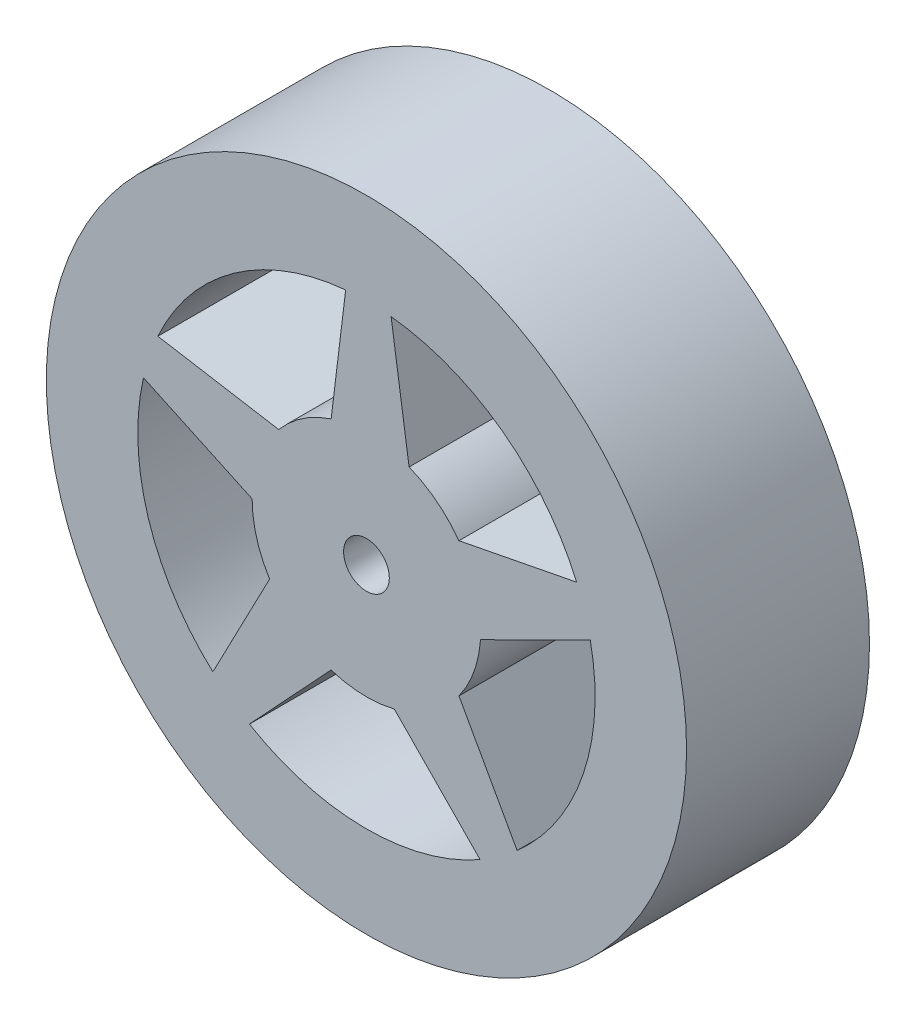
ISO-10303-21;
HEADER;
FILE_DESCRIPTION(('STEP AP214'),'2;1');
FILE_NAME('part.step','',(''),(''),'','','');
FILE_SCHEMA(('AUTOMOTIVE_DESIGN { 1 0 10303 214 1 1 1 1 }'));
ENDSEC;
DATA;
#1=APPLICATION_CONTEXT('core data for automotive mechanical design processes');
#2=APPLICATION_PROTOCOL_DEFINITION('international standard','automotive_design',2000,#1);
#3=PRODUCT_CONTEXT('',#1,'mechanical');
#4=PRODUCT('Part','Part','',(#3));
#5=PRODUCT_RELATED_PRODUCT_CATEGORY('part','',(#4));
#6=PRODUCT_DEFINITION_FORMATION('','',#4);
#7=PRODUCT_DEFINITION_CONTEXT('part definition',#1,'design');
#8=PRODUCT_DEFINITION('design','',#6,#7);
#9=PRODUCT_DEFINITION_SHAPE('','',#8);
#10=(LENGTH_UNIT() NAMED_UNIT(*) SI_UNIT(.MILLI.,.METRE.));
#11=(NAMED_UNIT(*) PLANE_ANGLE_UNIT() SI_UNIT($,.RADIAN.));
#12=(NAMED_UNIT(*) SI_UNIT($,.STERADIAN.) SOLID_ANGLE_UNIT());
#13=UNCERTAINTY_MEASURE_WITH_UNIT(LENGTH_MEASURE(1.E-05),#10,'distance_accuracy_value','');
#14=(GEOMETRIC_REPRESENTATION_CONTEXT(3) GLOBAL_UNCERTAINTY_ASSIGNED_CONTEXT((#13)) GLOBAL_UNIT_ASSIGNED_CONTEXT((#10,
#11,#12)) REPRESENTATION_CONTEXT('',''));
#15=CARTESIAN_POINT('',(0.,0.,0.));
#16=DIRECTION('',(0.,0.,1.));
#17=DIRECTION('',(1.,0.,0.));
#18=AXIS2_PLACEMENT_3D('',#15,#16,#17);
#19=CARTESIAN_POINT('',(0.,0.,-10.));
#20=DIRECTION('',(0.,0.,1.));
#21=DIRECTION('',(-1.,0.,0.));
#22=AXIS2_PLACEMENT_3D('',#19,#20,#21);
#23=CYLINDRICAL_SURFACE('',#22,25.);
#24=DIRECTION('',(0.,0.,1.));
#25=VECTOR('',#24,1.);
#26=CARTESIAN_POINT('',(24.4708623778841,5.11633604082602,-10.));
#27=LINE('',#26,#25);
#28=CARTESIAN_POINT('',(24.4708623778841,5.11633604082602,10.));
#29=VERTEX_POINT('',#28);
#30=CARTESIAN_POINT('',(24.4708623778841,5.11633604082602,-10.));
#31=VERTEX_POINT('',#30);
#32=EDGE_CURVE('E216',#29,#31,#27,.F.);
#33=ORIENTED_EDGE('',*,*,#32,.T.);
#34=CARTESIAN_POINT('',(0.,0.,-10.));
#35=DIRECTION('',(0.,0.,1.));
#36=DIRECTION('',(1.,0.,0.));
#37=AXIS2_PLACEMENT_3D('',#34,#35,#36);
#38=CIRCLE('',#37,25.);
#39=CARTESIAN_POINT('',(16.4712049980899,-18.8068978279486,-10.));
#40=VERTEX_POINT('',#39);
#41=EDGE_CURVE('E375',#40,#31,#38,.T.);
#42=ORIENTED_EDGE('',*,*,#41,.F.);
#43=DIRECTION('',(0.,0.,1.));
#44=VECTOR('',#43,1.);
#45=CARTESIAN_POINT('',(16.4712049980899,-18.8068978279486,-10.));
#46=LINE('',#45,#44);
#47=CARTESIAN_POINT('',(16.4712049980899,-18.8068978279486,10.));
#48=VERTEX_POINT('',#47);
#49=EDGE_CURVE('E336',#40,#48,#46,.T.);
#50=ORIENTED_EDGE('',*,*,#49,.T.);
#51=CARTESIAN_POINT('',(0.,0.,10.));
#52=DIRECTION('',(0.,0.,1.));
#53=DIRECTION('',(1.,0.,0.));
#54=AXIS2_PLACEMENT_3D('',#51,#52,#53);
#55=CIRCLE('',#54,25.);
#56=EDGE_CURVE('E361',#48,#29,#55,.T.);
#57=ORIENTED_EDGE('',*,*,#56,.T.);
#58=EDGE_LOOP('',(#33,#42,#50,#57));
#59=FACE_BOUND('',#58,.T.);
#60=ADVANCED_FACE('F39',(#59),#23,.F.);
#61=DIRECTION('',(0.,0.,1.));
#62=VECTOR('',#61,1.);
#63=CARTESIAN_POINT('',(-12.7965404683244,-21.4766978849761,-10.));
#64=LINE('',#63,#62);
#65=CARTESIAN_POINT('',(-12.7965404683244,-21.4766978849761,-10.));
#66=VERTEX_POINT('',#65);
#67=CARTESIAN_POINT('',(-12.7965404683244,-21.4766978849761,10.));
#68=VERTEX_POINT('',#67);
#69=EDGE_CURVE('E229',#66,#68,#64,.T.);
#70=ORIENTED_EDGE('',*,*,#69,.T.);
#71=CARTESIAN_POINT('',(12.42783707296,-21.6921383383004,10.));
#72=VERTEX_POINT('',#71);
#73=EDGE_CURVE('E354',#68,#72,#55,.T.);
#74=ORIENTED_EDGE('',*,*,#73,.T.);
#75=DIRECTION('',(0.,0.,1.));
#76=VECTOR('',#75,1.);
#77=CARTESIAN_POINT('',(12.42783707296,-21.6921383383004,-10.));
#78=LINE('',#77,#76);
#79=CARTESIAN_POINT('',(12.42783707296,-21.6921383383004,-10.));
#80=VERTEX_POINT('',#79);
#81=EDGE_CURVE('E339',#72,#80,#78,.F.);
#82=ORIENTED_EDGE('',*,*,#81,.T.);
#83=EDGE_CURVE('E355',#66,#80,#38,.T.);
#84=ORIENTED_EDGE('',*,*,#83,.F.);
#85=EDGE_LOOP('',(#70,#74,#82,#84));
#86=FACE_BOUND('',#85,.T.);
#87=ADVANCED_FACE('F352',(#86),#23,.F.);
#88=DIRECTION('',(0.,0.,1.));
#89=VECTOR('',#88,1.);
#90=CARTESIAN_POINT('',(-16.7900366601489,-18.5228148225602,-10.));
#91=LINE('',#90,#89);
#92=CARTESIAN_POINT('',(-16.7900366601489,-18.5228148225602,10.));
#93=VERTEX_POINT('',#92);
#94=CARTESIAN_POINT('',(-16.7900366601489,-18.5228148225602,-10.));
#95=VERTEX_POINT('',#94);
#96=EDGE_CURVE('E346',#93,#95,#91,.F.);
#97=ORIENTED_EDGE('',*,*,#96,.T.);
#98=CARTESIAN_POINT('',(-24.3799019459278,5.53356856892053,-10.));
#99=VERTEX_POINT('',#98);
#100=EDGE_CURVE('E253',#99,#95,#38,.T.);
#101=ORIENTED_EDGE('',*,*,#100,.F.);
#102=DIRECTION('',(0.,0.,1.));
#103=VECTOR('',#102,1.);
#104=CARTESIAN_POINT('',(-24.3799019459278,5.53356856892053,-10.));
#105=LINE('',#104,#103);
#106=CARTESIAN_POINT('',(-24.3799019459278,5.53356856892053,10.));
#107=VERTEX_POINT('',#106);
#108=EDGE_CURVE('E343',#99,#107,#105,.T.);
#109=ORIENTED_EDGE('',*,*,#108,.T.);
#110=EDGE_CURVE('E257',#107,#93,#55,.T.);
#111=ORIENTED_EDGE('',*,*,#110,.T.);
#112=EDGE_LOOP('',(#97,#101,#109,#111));
#113=FACE_BOUND('',#112,.T.);
#114=ADVANCED_FACE('F393',(#113),#23,.F.);
#115=DIRECTION('',(0.,0.,1.));
#116=VECTOR('',#115,1.);
#117=CARTESIAN_POINT('',(-22.8046504012887,10.2444092106379,-10.));
#118=LINE('',#117,#116);
#119=CARTESIAN_POINT('',(-22.8046504012887,10.2444092106379,10.));
#120=VERTEX_POINT('',#119);
#121=CARTESIAN_POINT('',(-22.8046504012887,10.2444092106379,-10.));
#122=VERTEX_POINT('',#121);
#123=EDGE_CURVE('E183',#120,#122,#118,.F.);
#124=ORIENTED_EDGE('',*,*,#123,.T.);
#125=CARTESIAN_POINT('',(-2.27106757664891,24.896631339647,-10.));
#126=VERTEX_POINT('',#125);
#127=EDGE_CURVE('E250',#126,#122,#38,.T.);
#128=ORIENTED_EDGE('',*,*,#127,.F.);
#129=DIRECTION('',(0.,0.,1.));
#130=VECTOR('',#129,1.);
#131=CARTESIAN_POINT('',(-2.27106757664891,24.896631339647,-10.));
#132=LINE('',#131,#130);
#133=CARTESIAN_POINT('',(-2.27106757664891,24.896631339647,10.));
#134=VERTEX_POINT('',#133);
#135=EDGE_CURVE('E47',#126,#134,#132,.T.);
#136=ORIENTED_EDGE('',*,*,#135,.T.);
#137=EDGE_CURVE('E255',#134,#120,#55,.T.);
#138=ORIENTED_EDGE('',*,*,#137,.T.);
#139=EDGE_LOOP('',(#124,#128,#136,#138));
#140=FACE_BOUND('',#139,.T.);
#141=ADVANCED_FACE('F265',(#140),#23,.F.);
#142=CARTESIAN_POINT('',(0.,0.,-10.));
#143=DIRECTION('',(0.,0.,1.));
#144=DIRECTION('',(-1.,0.,0.));
#145=AXIS2_PLACEMENT_3D('',#142,#143,#144);
#146=CYLINDRICAL_SURFACE('',#145,12.5);
#147=CARTESIAN_POINT('',(0.,0.,10.));
#148=DIRECTION('',(0.,0.,1.));
#149=DIRECTION('',(1.,0.,0.));
#150=AXIS2_PLACEMENT_3D('',#147,#148,#149);
#151=CIRCLE('',#150,12.5);
#152=CARTESIAN_POINT('',(10.1106359392021,-7.35017284864209,10.));
#153=VERTEX_POINT('',#152);
#154=CARTESIAN_POINT('',(12.4710442423428,-0.850326705171322,10.));
#155=VERTEX_POINT('',#154);
#156=EDGE_CURVE('E215',#153,#155,#151,.T.);
#157=ORIENTED_EDGE('',*,*,#156,.F.);
#158=DIRECTION('',(0.,0.,1.));
#159=VECTOR('',#158,1.);
#160=CARTESIAN_POINT('',(10.1106359392021,-7.35017284864209,-10.));
#161=LINE('',#160,#159);
#162=CARTESIAN_POINT('',(10.1106359392021,-7.35017284864209,-10.));
#163=VERTEX_POINT('',#162);
#164=EDGE_CURVE('E315',#163,#153,#161,.T.);
#165=ORIENTED_EDGE('',*,*,#164,.F.);
#166=CARTESIAN_POINT('',(0.,0.,-10.));
#167=DIRECTION('',(0.,0.,1.));
#168=DIRECTION('',(1.,0.,0.));
#169=AXIS2_PLACEMENT_3D('',#166,#167,#168);
#170=CIRCLE('',#169,12.5);
#171=CARTESIAN_POINT('',(12.4710442423428,-0.850326705171322,-10.));
#172=VERTEX_POINT('',#171);
#173=EDGE_CURVE('E268',#163,#172,#170,.T.);
#174=ORIENTED_EDGE('',*,*,#173,.T.);
#175=DIRECTION('',(0.,0.,1.));
#176=VECTOR('',#175,1.);
#177=CARTESIAN_POINT('',(12.4710442423428,-0.85032670517132,-10.));
#178=LINE('',#177,#176);
#179=EDGE_CURVE('E334',#172,#155,#178,.T.);
#180=ORIENTED_EDGE('',*,*,#179,.T.);
#181=EDGE_LOOP('',(#157,#165,#174,#180));
#182=FACE_BOUND('',#181,.T.);
#183=ADVANCED_FACE('F380',(#182),#146,.T.);
#184=CARTESIAN_POINT('',(-3.86607145444526,-11.8871145156898,-10.));
#185=VERTEX_POINT('',#184);
#186=CARTESIAN_POINT('',(3.04505585455277,-12.1234332943541,-10.));
#187=VERTEX_POINT('',#186);
#188=EDGE_CURVE('E272',#185,#187,#170,.T.);
#189=ORIENTED_EDGE('',*,*,#188,.T.);
#190=DIRECTION('',(0.,0.,1.));
#191=VECTOR('',#190,1.);
#192=CARTESIAN_POINT('',(3.04505585455277,-12.1234332943541,-10.));
#193=LINE('',#192,#191);
#194=CARTESIAN_POINT('',(3.04505585455277,-12.1234332943541,10.));
#195=VERTEX_POINT('',#194);
#196=EDGE_CURVE('E320',#187,#195,#193,.T.);
#197=ORIENTED_EDGE('',*,*,#196,.T.);
#198=CARTESIAN_POINT('',(-3.86607145444526,-11.8871145156898,10.));
#199=VERTEX_POINT('',#198);
#200=EDGE_CURVE('E212',#199,#195,#151,.T.);
#201=ORIENTED_EDGE('',*,*,#200,.F.);
#202=DIRECTION('',(0.,0.,1.));
#203=VECTOR('',#202,1.);
#204=CARTESIAN_POINT('',(-3.86607145444526,-11.8871145156898,-10.));
#205=LINE('',#204,#203);
#206=EDGE_CURVE('E306',#185,#199,#205,.T.);
#207=ORIENTED_EDGE('',*,*,#206,.F.);
#208=EDGE_LOOP('',(#189,#197,#201,#207));
#209=FACE_BOUND('',#208,.T.);
#210=ADVANCED_FACE('F378',(#209),#146,.T.);
#211=CARTESIAN_POINT('',(-12.499999500985,0.00353204978360225,10.));
#212=VERTEX_POINT('',#211);
#213=CARTESIAN_POINT('',(-10.5890962265874,-6.64236713108156,10.));
#214=VERTEX_POINT('',#213);
#215=EDGE_CURVE('E206',#212,#214,#151,.T.);
#216=ORIENTED_EDGE('',*,*,#215,.F.);
#217=DIRECTION('',(0.,0.,1.));
#218=VECTOR('',#217,1.);
#219=CARTESIAN_POINT('',(-12.499999500985,0.00353204978360225,-10.));
#220=LINE('',#219,#218);
#221=CARTESIAN_POINT('',(-12.499999500985,0.00353204978360052,-10.));
#222=VERTEX_POINT('',#221);
#223=EDGE_CURVE('E199',#222,#212,#220,.T.);
#224=ORIENTED_EDGE('',*,*,#223,.F.);
#225=CARTESIAN_POINT('',(-10.5890962265874,-6.64236713108156,-10.));
#226=VERTEX_POINT('',#225);
#227=EDGE_CURVE('E235',#222,#226,#170,.T.);
#228=ORIENTED_EDGE('',*,*,#227,.T.);
#229=DIRECTION('',(0.,0.,1.));
#230=VECTOR('',#229,1.);
#231=CARTESIAN_POINT('',(-10.5890962265874,-6.64236713108157,-10.));
#232=LINE('',#231,#230);
#233=EDGE_CURVE('E289',#226,#214,#232,.T.);
#234=ORIENTED_EDGE('',*,*,#233,.T.);
#235=EDGE_LOOP('',(#216,#224,#228,#234));
#236=FACE_BOUND('',#235,.T.);
#237=ADVANCED_FACE('F287',(#236),#146,.T.);
#238=CARTESIAN_POINT('',(-3.85935309652028,11.889297442506,10.));
#239=VERTEX_POINT('',#238);
#240=CARTESIAN_POINT('',(-9.58947723272698,8.01822464159062,10.));
#241=VERTEX_POINT('',#240);
#242=EDGE_CURVE('E195',#239,#241,#151,.T.);
#243=ORIENTED_EDGE('',*,*,#242,.F.);
#244=DIRECTION('',(0.,0.,1.));
#245=VECTOR('',#244,1.);
#246=CARTESIAN_POINT('',(-3.85935309652028,11.889297442506,-10.));
#247=LINE('',#246,#245);
#248=CARTESIAN_POINT('',(-3.85935309652028,11.889297442506,-10.));
#249=VERTEX_POINT('',#248);
#250=EDGE_CURVE('E239',#249,#239,#247,.T.);
#251=ORIENTED_EDGE('',*,*,#250,.F.);
#252=CARTESIAN_POINT('',(-9.58947723272698,8.01822464159062,-10.));
#253=VERTEX_POINT('',#252);
#254=EDGE_CURVE('E197',#249,#253,#170,.T.);
#255=ORIENTED_EDGE('',*,*,#254,.T.);
#256=DIRECTION('',(0.,0.,1.));
#257=VECTOR('',#256,1.);
#258=CARTESIAN_POINT('',(-9.58947723272698,8.01822464159062,-10.));
#259=LINE('',#258,#257);
#260=EDGE_CURVE('E180',#253,#241,#259,.T.);
#261=ORIENTED_EDGE('',*,*,#260,.T.);
#262=EDGE_LOOP('',(#243,#251,#255,#261));
#263=FACE_BOUND('',#262,.T.);
#264=ADVANCED_FACE('F193',(#263),#146,.T.);
#265=CARTESIAN_POINT('',(0.,0.,-10.));
#266=DIRECTION('',(0.,0.,-1.));
#267=DIRECTION('',(1.,0.,0.));
#268=AXIS2_PLACEMENT_3D('',#265,#266,#267);
#269=PLANE('',#268);
#270=CARTESIAN_POINT('',(0.,0.,-10.));
#271=DIRECTION('',(0.,0.,1.));
#272=DIRECTION('',(1.,0.,0.));
#273=AXIS2_PLACEMENT_3D('',#270,#271,#272);
#274=CIRCLE('',#273,2.5);
#275=CARTESIAN_POINT('',(2.5,0.,-10.));
#276=VERTEX_POINT('',#275);
#277=EDGE_CURVE('E418',#276,#276,#274,.T.);
#278=ORIENTED_EDGE('',*,*,#277,.T.);
#279=EDGE_LOOP('',(#278));
#280=FACE_BOUND('',#279,.T.);
#281=CARTESIAN_POINT('',(10.1147881127483,7.34445787204241,-10.));
#282=VERTEX_POINT('',#281);
#283=CARTESIAN_POINT('',(4.66247336241872,11.5979024890165,-10.));
#284=VERTEX_POINT('',#283);
#285=EDGE_CURVE('E236',#282,#284,#170,.T.);
#286=ORIENTED_EDGE('',*,*,#285,.F.);
#287=DIRECTION('',(0.981499575248451,0.191464314657094,0.));
#288=VECTOR('',#287,1.);
#289=CARTESIAN_POINT('',(-1.00939245872167,5.17442778446024,-10.));
#290=LINE('',#289,#288);
#291=CARTESIAN_POINT('',(22.976304992811,9.85339580435737,-10.));
#292=VERTEX_POINT('',#291);
#293=EDGE_CURVE('E325',#282,#292,#290,.T.);
#294=ORIENTED_EDGE('',*,*,#293,.T.);
#295=CARTESIAN_POINT('',(2.69598761059333,24.8542079093969,-10.));
#296=VERTEX_POINT('',#295);
#297=EDGE_CURVE('E254',#292,#296,#38,.T.);
#298=ORIENTED_EDGE('',*,*,#297,.T.);
#299=DIRECTION('',(0.146737673225105,-0.989175442101391,0.));
#300=VECTOR('',#299,1.);
#301=CARTESIAN_POINT('',(6.24550870366448,0.92648015334466,-10.));
#302=LINE('',#301,#300);
#303=EDGE_CURVE('E234',#296,#284,#302,.T.);
#304=ORIENTED_EDGE('',*,*,#303,.T.);
#305=EDGE_LOOP('',(#286,#294,#298,#304));
#306=FACE_BOUND('',#305,.T.);
#307=DIRECTION('',(0.121206664630946,0.992627293826359,0.));
#308=VECTOR('',#307,1.);
#309=CARTESIAN_POINT('',(-5.23309268624852,0.638996846197679,-10.));
#310=LINE('',#309,#308);
#311=EDGE_CURVE('E238',#249,#126,#310,.T.);
#312=ORIENTED_EDGE('',*,*,#311,.T.);
#313=ORIENTED_EDGE('',*,*,#127,.T.);
#314=DIRECTION('',(0.986106184711261,-0.166116201720968,0.));
#315=VECTOR('',#314,1.);
#316=CARTESIAN_POINT('',(1.04883334089247,6.2261298625328,-10.));
#317=LINE('',#316,#315);
#318=EDGE_CURVE('E414',#122,#253,#317,.T.);
#319=ORIENTED_EDGE('',*,*,#318,.T.);
#320=ORIENTED_EDGE('',*,*,#254,.F.);
#321=EDGE_LOOP('',(#312,#313,#319,#320));
#322=FACE_BOUND('',#321,.T.);
#323=ORIENTED_EDGE('',*,*,#83,.T.);
#324=DIRECTION('',(-0.700136008151229,0.714009502800952,0.));
#325=VECTOR('',#324,1.);
#326=CARTESIAN_POINT('',(-4.50815130910358,-4.42055609808518,-10.));
#327=LINE('',#326,#325);
#328=EDGE_CURVE('E62',#80,#187,#327,.T.);
#329=ORIENTED_EDGE('',*,*,#328,.T.);
#330=ORIENTED_EDGE('',*,*,#188,.F.);
#331=DIRECTION('',(-0.681509935852068,-0.731808859836303,0.));
#332=VECTOR('',#331,1.);
#333=CARTESIAN_POINT('',(3.85806799385786,-3.59289401278243,-10.));
#334=LINE('',#333,#332);
#335=EDGE_CURVE('E301',#185,#66,#334,.T.);
#336=ORIENTED_EDGE('',*,*,#335,.T.);
#337=EDGE_LOOP('',(#323,#329,#330,#336));
#338=FACE_BOUND('',#337,.T.);
#339=ORIENTED_EDGE('',*,*,#100,.T.);
#340=DIRECTION('',(0.462709465442945,0.886509983355802,0.));
#341=VECTOR('',#340,1.);
#342=CARTESIAN_POINT('',(-5.59729405045885,2.92147972007138,-10.));
#343=LINE('',#342,#341);
#344=EDGE_CURVE('E296',#95,#226,#343,.T.);
#345=ORIENTED_EDGE('',*,*,#344,.T.);
#346=ORIENTED_EDGE('',*,*,#227,.F.);
#347=DIRECTION('',(-0.906589736843511,0.422013091088432,0.));
#348=VECTOR('',#347,1.);
#349=CARTESIAN_POINT('',(-2.22483668765845,-4.77950601480606,-10.));
#350=LINE('',#349,#348);
#351=EDGE_CURVE('E294',#222,#99,#350,.T.);
#352=ORIENTED_EDGE('',*,*,#351,.T.);
#353=EDGE_LOOP('',(#339,#345,#346,#352));
#354=FACE_BOUND('',#353,.T.);
#355=DIRECTION('',(-0.895417315228074,-0.445227842334404,0.));
#356=VECTOR('',#355,1.);
#357=CARTESIAN_POINT('',(2.81110331500553,-5.6535336378636,-10.));
#358=LINE('',#357,#356);
#359=EDGE_CURVE('E323',#31,#172,#358,.T.);
#360=ORIENTED_EDGE('',*,*,#359,.T.);
#361=ORIENTED_EDGE('',*,*,#173,.F.);
#362=DIRECTION('',(0.485393432816176,-0.874295839735572,0.));
#363=VECTOR('',#362,1.);
#364=CARTESIAN_POINT('',(4.60925383877071,2.55897539693054,-10.));
#365=LINE('',#364,#363);
#366=EDGE_CURVE('E54',#163,#40,#365,.T.);
#367=ORIENTED_EDGE('',*,*,#366,.T.);
#368=ORIENTED_EDGE('',*,*,#41,.T.);
#369=EDGE_LOOP('',(#360,#361,#367,#368));
#370=FACE_BOUND('',#369,.T.);
#371=CARTESIAN_POINT('',(0.,0.,-10.));
#372=DIRECTION('',(0.,0.,1.));
#373=DIRECTION('',(1.,0.,0.));
#374=AXIS2_PLACEMENT_3D('',#371,#372,#373);
#375=CIRCLE('',#374,35.);
#376=CARTESIAN_POINT('',(35.,0.,-10.));
#377=VERTEX_POINT('',#376);
#378=EDGE_CURVE('E258',#377,#377,#375,.T.);
#379=ORIENTED_EDGE('',*,*,#378,.F.);
#380=EDGE_LOOP('',(#379));
#381=FACE_BOUND('',#380,.T.);
#382=ADVANCED_FACE('F293',(#280,#306,#322,#338,#354,#370,#381),#269,.T.);
#383=CARTESIAN_POINT('',(0.,0.,10.));
#384=DIRECTION('',(0.,0.,-1.));
#385=DIRECTION('',(1.,0.,0.));
#386=AXIS2_PLACEMENT_3D('',#383,#384,#385);
#387=PLANE('',#386);
#388=CARTESIAN_POINT('',(0.,0.,10.));
#389=DIRECTION('',(0.,0.,1.));
#390=DIRECTION('',(1.,0.,0.));
#391=AXIS2_PLACEMENT_3D('',#388,#389,#390);
#392=CIRCLE('',#391,2.5);
#393=CARTESIAN_POINT('',(2.5,0.,10.));
#394=VERTEX_POINT('',#393);
#395=EDGE_CURVE('E189',#394,#394,#392,.T.);
#396=ORIENTED_EDGE('',*,*,#395,.F.);
#397=EDGE_LOOP('',(#396));
#398=FACE_BOUND('',#397,.T.);
#399=DIRECTION('',(0.146737673225105,-0.989175442101391,0.));
#400=VECTOR('',#399,1.);
#401=CARTESIAN_POINT('',(6.24550870366448,0.92648015334466,10.));
#402=LINE('',#401,#400);
#403=CARTESIAN_POINT('',(2.69598761059333,24.8542079093969,10.));
#404=VERTEX_POINT('',#403);
#405=CARTESIAN_POINT('',(4.66247336241872,11.5979024890165,10.));
#406=VERTEX_POINT('',#405);
#407=EDGE_CURVE('E205',#404,#406,#402,.T.);
#408=ORIENTED_EDGE('',*,*,#407,.F.);
#409=CARTESIAN_POINT('',(22.976304992811,9.85339580435736,10.));
#410=VERTEX_POINT('',#409);
#411=EDGE_CURVE('E246',#410,#404,#55,.T.);
#412=ORIENTED_EDGE('',*,*,#411,.F.);
#413=DIRECTION('',(0.981499575248451,0.191464314657094,0.));
#414=VECTOR('',#413,1.);
#415=CARTESIAN_POINT('',(-1.00939245872167,5.17442778446024,10.));
#416=LINE('',#415,#414);
#417=CARTESIAN_POINT('',(10.1147881127483,7.34445787204241,10.));
#418=VERTEX_POINT('',#417);
#419=EDGE_CURVE('E326',#418,#410,#416,.T.);
#420=ORIENTED_EDGE('',*,*,#419,.F.);
#421=EDGE_CURVE('E208',#418,#406,#151,.T.);
#422=ORIENTED_EDGE('',*,*,#421,.T.);
#423=EDGE_LOOP('',(#408,#412,#420,#422));
#424=FACE_BOUND('',#423,.T.);
#425=ORIENTED_EDGE('',*,*,#242,.T.);
#426=DIRECTION('',(0.986106184711261,-0.166116201720968,0.));
#427=VECTOR('',#426,1.);
#428=CARTESIAN_POINT('',(1.04883334089247,6.2261298625328,10.));
#429=LINE('',#428,#427);
#430=EDGE_CURVE('E177',#120,#241,#429,.T.);
#431=ORIENTED_EDGE('',*,*,#430,.F.);
#432=ORIENTED_EDGE('',*,*,#137,.F.);
#433=DIRECTION('',(0.121206664630946,0.992627293826359,0.));
#434=VECTOR('',#433,1.);
#435=CARTESIAN_POINT('',(-5.23309268624852,0.638996846197679,10.));
#436=LINE('',#435,#434);
#437=EDGE_CURVE('E203',#239,#134,#436,.T.);
#438=ORIENTED_EDGE('',*,*,#437,.F.);
#439=EDGE_LOOP('',(#425,#431,#432,#438));
#440=FACE_BOUND('',#439,.T.);
#441=DIRECTION('',(-0.681509935852068,-0.731808859836303,0.));
#442=VECTOR('',#441,1.);
#443=CARTESIAN_POINT('',(3.85806799385786,-3.59289401278243,10.));
#444=LINE('',#443,#442);
#445=EDGE_CURVE('E302',#199,#68,#444,.T.);
#446=ORIENTED_EDGE('',*,*,#445,.F.);
#447=ORIENTED_EDGE('',*,*,#200,.T.);
#448=DIRECTION('',(-0.700136008151229,0.714009502800952,0.));
#449=VECTOR('',#448,1.);
#450=CARTESIAN_POINT('',(-4.50815130910358,-4.42055609808518,10.));
#451=LINE('',#450,#449);
#452=EDGE_CURVE('E305',#72,#195,#451,.T.);
#453=ORIENTED_EDGE('',*,*,#452,.F.);
#454=ORIENTED_EDGE('',*,*,#73,.F.);
#455=EDGE_LOOP('',(#446,#447,#453,#454));
#456=FACE_BOUND('',#455,.T.);
#457=DIRECTION('',(-0.906589736843511,0.422013091088432,0.));
#458=VECTOR('',#457,1.);
#459=CARTESIAN_POINT('',(-2.22483668765845,-4.77950601480606,10.));
#460=LINE('',#459,#458);
#461=EDGE_CURVE('E188',#212,#107,#460,.T.);
#462=ORIENTED_EDGE('',*,*,#461,.F.);
#463=ORIENTED_EDGE('',*,*,#215,.T.);
#464=DIRECTION('',(0.462709465442945,0.886509983355802,0.));
#465=VECTOR('',#464,1.);
#466=CARTESIAN_POINT('',(-5.59729405045885,2.92147972007138,10.));
#467=LINE('',#466,#465);
#468=EDGE_CURVE('E198',#93,#214,#467,.T.);
#469=ORIENTED_EDGE('',*,*,#468,.F.);
#470=ORIENTED_EDGE('',*,*,#110,.F.);
#471=EDGE_LOOP('',(#462,#463,#469,#470));
#472=FACE_BOUND('',#471,.T.);
#473=ORIENTED_EDGE('',*,*,#56,.F.);
#474=DIRECTION('',(0.485393432816176,-0.874295839735572,0.));
#475=VECTOR('',#474,1.);
#476=CARTESIAN_POINT('',(4.60925383877071,2.55897539693054,10.));
#477=LINE('',#476,#475);
#478=EDGE_CURVE('E308',#153,#48,#477,.T.);
#479=ORIENTED_EDGE('',*,*,#478,.F.);
#480=ORIENTED_EDGE('',*,*,#156,.T.);
#481=DIRECTION('',(-0.895417315228074,-0.445227842334404,0.));
#482=VECTOR('',#481,1.);
#483=CARTESIAN_POINT('',(2.81110331500553,-5.6535336378636,10.));
#484=LINE('',#483,#482);
#485=EDGE_CURVE('E322',#29,#155,#484,.T.);
#486=ORIENTED_EDGE('',*,*,#485,.F.);
#487=EDGE_LOOP('',(#473,#479,#480,#486));
#488=FACE_BOUND('',#487,.T.);
#489=CARTESIAN_POINT('',(0.,0.,10.));
#490=DIRECTION('',(0.,0.,1.));
#491=DIRECTION('',(1.,0.,0.));
#492=AXIS2_PLACEMENT_3D('',#489,#490,#491);
#493=CIRCLE('',#492,35.);
#494=CARTESIAN_POINT('',(35.,0.,10.));
#495=VERTEX_POINT('',#494);
#496=EDGE_CURVE('E252',#495,#495,#493,.T.);
#497=ORIENTED_EDGE('',*,*,#496,.T.);
#498=EDGE_LOOP('',(#497));
#499=FACE_BOUND('',#498,.T.);
#500=ADVANCED_FACE('F201',(#398,#424,#440,#456,#472,#488,#499),#387,.F.);
#501=CARTESIAN_POINT('',(0.,0.,-10.));
#502=DIRECTION('',(0.,0.,1.));
#503=DIRECTION('',(-1.,0.,0.));
#504=AXIS2_PLACEMENT_3D('',#501,#502,#503);
#505=CYLINDRICAL_SURFACE('',#504,35.);
#506=ORIENTED_EDGE('',*,*,#378,.T.);
#507=EDGE_LOOP('',(#506));
#508=FACE_BOUND('',#507,.T.);
#509=ORIENTED_EDGE('',*,*,#496,.F.);
#510=EDGE_LOOP('',(#509));
#511=FACE_BOUND('',#510,.T.);
#512=ADVANCED_FACE('F41',(#508,#511),#505,.T.);
#513=DIRECTION('',(0.,0.,1.));
#514=VECTOR('',#513,1.);
#515=CARTESIAN_POINT('',(22.976304992811,9.85339580435736,-10.));
#516=LINE('',#515,#514);
#517=EDGE_CURVE('E223',#292,#410,#516,.T.);
#518=ORIENTED_EDGE('',*,*,#517,.T.);
#519=ORIENTED_EDGE('',*,*,#411,.T.);
#520=DIRECTION('',(0.,0.,1.));
#521=VECTOR('',#520,1.);
#522=CARTESIAN_POINT('',(2.69598761059333,24.8542079093969,-10.));
#523=LINE('',#522,#521);
#524=EDGE_CURVE('E11',#404,#296,#523,.F.);
#525=ORIENTED_EDGE('',*,*,#524,.T.);
#526=ORIENTED_EDGE('',*,*,#297,.F.);
#527=EDGE_LOOP('',(#518,#519,#525,#526));
#528=FACE_BOUND('',#527,.T.);
#529=ADVANCED_FACE('F367',(#528),#23,.F.);
#530=ORIENTED_EDGE('',*,*,#285,.T.);
#531=DIRECTION('',(0.,0.,1.));
#532=VECTOR('',#531,1.);
#533=CARTESIAN_POINT('',(4.66247336241872,11.5979024890165,-10.));
#534=LINE('',#533,#532);
#535=EDGE_CURVE('E243',#284,#406,#534,.T.);
#536=ORIENTED_EDGE('',*,*,#535,.T.);
#537=ORIENTED_EDGE('',*,*,#421,.F.);
#538=DIRECTION('',(0.,0.,1.));
#539=VECTOR('',#538,1.);
#540=CARTESIAN_POINT('',(10.1147881127483,7.34445787204241,-10.));
#541=LINE('',#540,#539);
#542=EDGE_CURVE('E329',#282,#418,#541,.T.);
#543=ORIENTED_EDGE('',*,*,#542,.F.);
#544=EDGE_LOOP('',(#530,#536,#537,#543));
#545=FACE_BOUND('',#544,.T.);
#546=ADVANCED_FACE('F386',(#545),#146,.T.);
#547=CARTESIAN_POINT('',(6.24550870366448,0.92648015334466,-10.));
#548=DIRECTION('',(0.989175442101391,0.146737673225105,0.));
#549=DIRECTION('',(-0.146737673225105,0.989175442101391,0.));
#550=AXIS2_PLACEMENT_3D('',#547,#548,#549);
#551=PLANE('',#550);
#552=ORIENTED_EDGE('',*,*,#407,.T.);
#553=ORIENTED_EDGE('',*,*,#535,.F.);
#554=ORIENTED_EDGE('',*,*,#303,.F.);
#555=ORIENTED_EDGE('',*,*,#524,.F.);
#556=EDGE_LOOP('',(#552,#553,#554,#555));
#557=FACE_BOUND('',#556,.T.);
#558=ADVANCED_FACE('F371',(#557),#551,.T.);
#559=CARTESIAN_POINT('',(-5.23309268624852,0.638996846197679,-10.));
#560=DIRECTION('',(-0.992627293826359,0.121206664630946,0.));
#561=DIRECTION('',(-0.121206664630946,-0.992627293826359,0.));
#562=AXIS2_PLACEMENT_3D('',#559,#560,#561);
#563=PLANE('',#562);
#564=ORIENTED_EDGE('',*,*,#311,.F.);
#565=ORIENTED_EDGE('',*,*,#250,.T.);
#566=ORIENTED_EDGE('',*,*,#437,.T.);
#567=ORIENTED_EDGE('',*,*,#135,.F.);
#568=EDGE_LOOP('',(#564,#565,#566,#567));
#569=FACE_BOUND('',#568,.T.);
#570=ADVANCED_FACE('F266',(#569),#563,.T.);
#571=CARTESIAN_POINT('',(4.60925383877071,2.55897539693054,-10.));
#572=DIRECTION('',(0.874295839735572,0.485393432816176,0.));
#573=DIRECTION('',(-0.485393432816176,0.874295839735571,0.));
#574=AXIS2_PLACEMENT_3D('',#571,#572,#573);
#575=PLANE('',#574);
#576=ORIENTED_EDGE('',*,*,#366,.F.);
#577=ORIENTED_EDGE('',*,*,#164,.T.);
#578=ORIENTED_EDGE('',*,*,#478,.T.);
#579=ORIENTED_EDGE('',*,*,#49,.F.);
#580=EDGE_LOOP('',(#576,#577,#578,#579));
#581=FACE_BOUND('',#580,.T.);
#582=ADVANCED_FACE('F456',(#581),#575,.T.);
#583=CARTESIAN_POINT('',(-4.50815130910358,-4.42055609808518,-10.));
#584=DIRECTION('',(-0.714009502800952,-0.700136008151228,0.));
#585=DIRECTION('',(0.700136008151229,-0.714009502800952,0.));
#586=AXIS2_PLACEMENT_3D('',#583,#584,#585);
#587=PLANE('',#586);
#588=ORIENTED_EDGE('',*,*,#452,.T.);
#589=ORIENTED_EDGE('',*,*,#196,.F.);
#590=ORIENTED_EDGE('',*,*,#328,.F.);
#591=ORIENTED_EDGE('',*,*,#81,.F.);
#592=EDGE_LOOP('',(#588,#589,#590,#591));
#593=FACE_BOUND('',#592,.T.);
#594=ADVANCED_FACE('F377',(#593),#587,.T.);
#595=CARTESIAN_POINT('',(-2.22483668765845,-4.77950601480606,-10.));
#596=DIRECTION('',(-0.422013091088432,-0.906589736843511,0.));
#597=DIRECTION('',(0.906589736843511,-0.422013091088432,0.));
#598=AXIS2_PLACEMENT_3D('',#595,#596,#597);
#599=PLANE('',#598);
#600=ORIENTED_EDGE('',*,*,#351,.F.);
#601=ORIENTED_EDGE('',*,*,#223,.T.);
#602=ORIENTED_EDGE('',*,*,#461,.T.);
#603=ORIENTED_EDGE('',*,*,#108,.F.);
#604=EDGE_LOOP('',(#600,#601,#602,#603));
#605=FACE_BOUND('',#604,.T.);
#606=ADVANCED_FACE('F446',(#605),#599,.T.);
#607=CARTESIAN_POINT('',(1.04883334089247,6.2261298625328,-10.));
#608=DIRECTION('',(0.166116201720968,0.986106184711261,0.));
#609=DIRECTION('',(-0.986106184711261,0.166116201720968,0.));
#610=AXIS2_PLACEMENT_3D('',#607,#608,#609);
#611=PLANE('',#610);
#612=ORIENTED_EDGE('',*,*,#430,.T.);
#613=ORIENTED_EDGE('',*,*,#260,.F.);
#614=ORIENTED_EDGE('',*,*,#318,.F.);
#615=ORIENTED_EDGE('',*,*,#123,.F.);
#616=EDGE_LOOP('',(#612,#613,#614,#615));
#617=FACE_BOUND('',#616,.T.);
#618=ADVANCED_FACE('F179',(#617),#611,.T.);
#619=CARTESIAN_POINT('',(3.85806799385786,-3.59289401278243,-10.));
#620=DIRECTION('',(0.731808859836303,-0.681509935852068,0.));
#621=DIRECTION('',(0.681509935852068,0.731808859836303,0.));
#622=AXIS2_PLACEMENT_3D('',#619,#620,#621);
#623=PLANE('',#622);
#624=ORIENTED_EDGE('',*,*,#335,.F.);
#625=ORIENTED_EDGE('',*,*,#206,.T.);
#626=ORIENTED_EDGE('',*,*,#445,.T.);
#627=ORIENTED_EDGE('',*,*,#69,.F.);
#628=EDGE_LOOP('',(#624,#625,#626,#627));
#629=FACE_BOUND('',#628,.T.);
#630=ADVANCED_FACE('F357',(#629),#623,.T.);
#631=CARTESIAN_POINT('',(-5.59729405045885,2.92147972007138,-10.));
#632=DIRECTION('',(-0.886509983355802,0.462709465442945,0.));
#633=DIRECTION('',(-0.462709465442945,-0.886509983355802,0.));
#634=AXIS2_PLACEMENT_3D('',#631,#632,#633);
#635=PLANE('',#634);
#636=ORIENTED_EDGE('',*,*,#468,.T.);
#637=ORIENTED_EDGE('',*,*,#233,.F.);
#638=ORIENTED_EDGE('',*,*,#344,.F.);
#639=ORIENTED_EDGE('',*,*,#96,.F.);
#640=EDGE_LOOP('',(#636,#637,#638,#639));
#641=FACE_BOUND('',#640,.T.);
#642=ADVANCED_FACE('F304',(#641),#635,.T.);
#643=CARTESIAN_POINT('',(2.81110331500553,-5.6535336378636,-10.));
#644=DIRECTION('',(0.445227842334404,-0.895417315228073,0.));
#645=DIRECTION('',(0.895417315228073,0.445227842334404,0.));
#646=AXIS2_PLACEMENT_3D('',#643,#644,#645);
#647=PLANE('',#646);
#648=ORIENTED_EDGE('',*,*,#485,.T.);
#649=ORIENTED_EDGE('',*,*,#179,.F.);
#650=ORIENTED_EDGE('',*,*,#359,.F.);
#651=ORIENTED_EDGE('',*,*,#32,.F.);
#652=EDGE_LOOP('',(#648,#649,#650,#651));
#653=FACE_BOUND('',#652,.T.);
#654=ADVANCED_FACE('F442',(#653),#647,.T.);
#655=CARTESIAN_POINT('',(-1.00939245872167,5.17442778446024,-10.));
#656=DIRECTION('',(-0.191464314657094,0.981499575248451,0.));
#657=DIRECTION('',(-0.981499575248451,-0.191464314657094,0.));
#658=AXIS2_PLACEMENT_3D('',#655,#656,#657);
#659=PLANE('',#658);
#660=ORIENTED_EDGE('',*,*,#293,.F.);
#661=ORIENTED_EDGE('',*,*,#542,.T.);
#662=ORIENTED_EDGE('',*,*,#419,.T.);
#663=ORIENTED_EDGE('',*,*,#517,.F.);
#664=EDGE_LOOP('',(#660,#661,#662,#663));
#665=FACE_BOUND('',#664,.T.);
#666=ADVANCED_FACE('F437',(#665),#659,.T.);
#667=CARTESIAN_POINT('',(0.,0.,10.));
#668=DIRECTION('',(0.,0.,-1.));
#669=DIRECTION('',(1.,0.,0.));
#670=AXIS2_PLACEMENT_3D('',#667,#668,#669);
#671=CYLINDRICAL_SURFACE('',#670,2.5);
#672=ORIENTED_EDGE('',*,*,#395,.T.);
#673=EDGE_LOOP('',(#672));
#674=FACE_BOUND('',#673,.T.);
#675=ORIENTED_EDGE('',*,*,#277,.F.);
#676=EDGE_LOOP('',(#675));
#677=FACE_BOUND('',#676,.T.);
#678=ADVANCED_FACE('F424',(#674,#677),#671,.F.);
#679=CLOSED_SHELL('',(#60,#87,#114,#141,#183,#210,#237,#264,#382,#500,#512,#529,#546,#558,#570,
#582,#594,#606,#618,#630,#642,#654,#666,#678));
#680=MANIFOLD_SOLID_BREP('B2',#679);
#681=ADVANCED_BREP_SHAPE_REPRESENTATION('',(#18,#680),#14);
#682=SHAPE_DEFINITION_REPRESENTATION(#9,#681);
ENDSEC;
END-ISO-10303-21;
